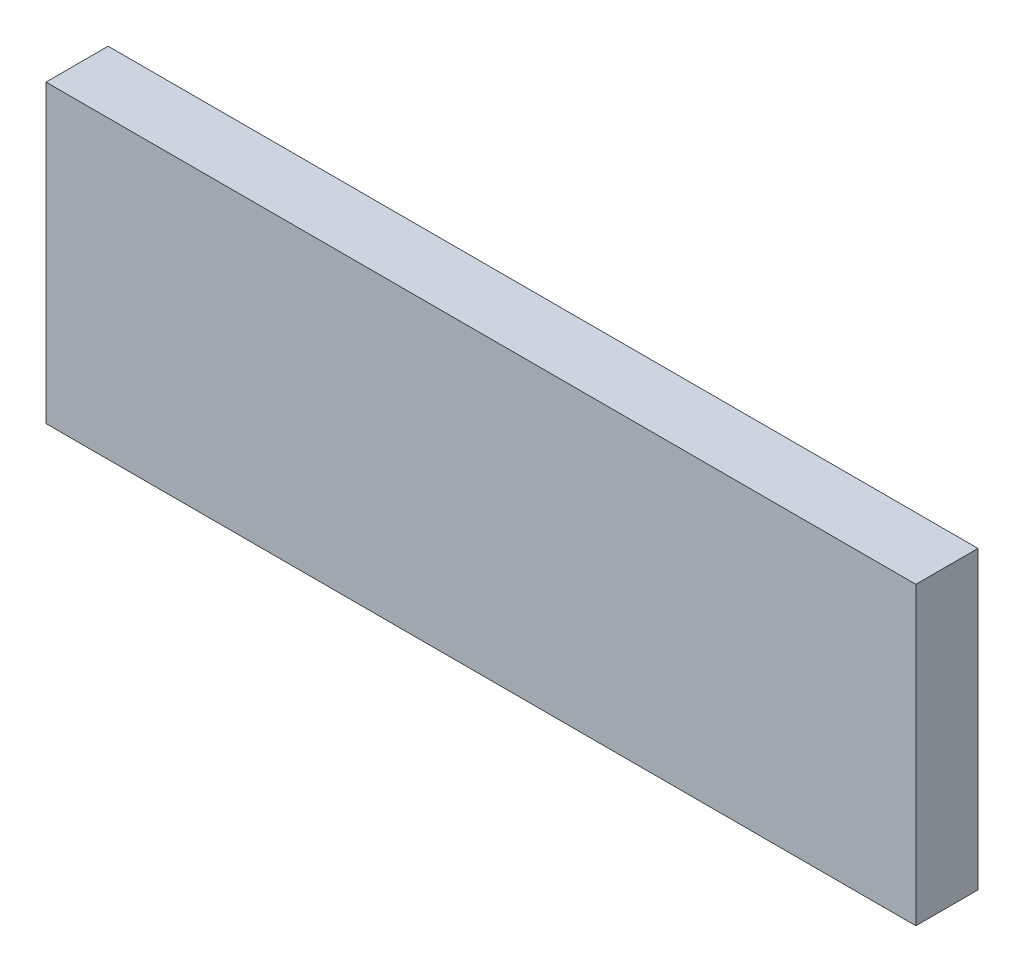
ISO-10303-21;
HEADER;
FILE_DESCRIPTION(('STEP AP214'),'2;1');
FILE_NAME('part.step','',(''),(''),'','','');
FILE_SCHEMA(('AUTOMOTIVE_DESIGN { 1 0 10303 214 1 1 1 1 }'));
ENDSEC;
DATA;
#1=APPLICATION_CONTEXT('core data for automotive mechanical design processes');
#2=APPLICATION_PROTOCOL_DEFINITION('international standard','automotive_design',2000,#1);
#3=PRODUCT_CONTEXT('',#1,'mechanical');
#4=PRODUCT('Part','Part','',(#3));
#5=PRODUCT_RELATED_PRODUCT_CATEGORY('part','',(#4));
#6=PRODUCT_DEFINITION_FORMATION('','',#4);
#7=PRODUCT_DEFINITION_CONTEXT('part definition',#1,'design');
#8=PRODUCT_DEFINITION('design','',#6,#7);
#9=PRODUCT_DEFINITION_SHAPE('','',#8);
#10=(LENGTH_UNIT() NAMED_UNIT(*) SI_UNIT(.MILLI.,.METRE.));
#11=(NAMED_UNIT(*) PLANE_ANGLE_UNIT() SI_UNIT($,.RADIAN.));
#12=(NAMED_UNIT(*) SI_UNIT($,.STERADIAN.) SOLID_ANGLE_UNIT());
#13=UNCERTAINTY_MEASURE_WITH_UNIT(LENGTH_MEASURE(1.E-05),#10,'distance_accuracy_value','');
#14=(GEOMETRIC_REPRESENTATION_CONTEXT(3) GLOBAL_UNCERTAINTY_ASSIGNED_CONTEXT((#13)) GLOBAL_UNIT_ASSIGNED_CONTEXT((#10,
#11,#12)) REPRESENTATION_CONTEXT('',''));
#15=CARTESIAN_POINT('',(0.,0.,0.));
#16=DIRECTION('',(0.,0.,1.));
#17=DIRECTION('',(1.,0.,0.));
#18=AXIS2_PLACEMENT_3D('',#15,#16,#17);
#19=CARTESIAN_POINT('',(88.9,30.226,12.7));
#20=DIRECTION('',(-1.,0.,0.));
#21=DIRECTION('',(0.,-1.,0.));
#22=AXIS2_PLACEMENT_3D('',#19,#20,#21);
#23=PLANE('',#22);
#24=DIRECTION('',(0.,1.,0.));
#25=VECTOR('',#24,1.);
#26=CARTESIAN_POINT('',(88.9,30.226,0.));
#27=LINE('',#26,#25);
#28=CARTESIAN_POINT('',(88.9,-30.226,0.));
#29=VERTEX_POINT('',#28);
#30=CARTESIAN_POINT('',(88.9,30.226,0.));
#31=VERTEX_POINT('',#30);
#32=EDGE_CURVE('E95',#29,#31,#27,.T.);
#33=ORIENTED_EDGE('',*,*,#32,.T.);
#34=DIRECTION('',(0.,0.,-1.));
#35=VECTOR('',#34,1.);
#36=CARTESIAN_POINT('',(88.9,30.226,12.7));
#37=LINE('',#36,#35);
#38=CARTESIAN_POINT('',(88.9,30.226,12.7));
#39=VERTEX_POINT('',#38);
#40=EDGE_CURVE('E11',#39,#31,#37,.T.);
#41=ORIENTED_EDGE('',*,*,#40,.F.);
#42=DIRECTION('',(0.,1.,0.));
#43=VECTOR('',#42,1.);
#44=CARTESIAN_POINT('',(88.9,30.226,12.7));
#45=LINE('',#44,#43);
#46=CARTESIAN_POINT('',(88.9,-30.226,12.7));
#47=VERTEX_POINT('',#46);
#48=EDGE_CURVE('E83',#47,#39,#45,.T.);
#49=ORIENTED_EDGE('',*,*,#48,.F.);
#50=DIRECTION('',(0.,0.,-1.));
#51=VECTOR('',#50,1.);
#52=CARTESIAN_POINT('',(88.9,-30.226,12.7));
#53=LINE('',#52,#51);
#54=EDGE_CURVE('E91',#47,#29,#53,.T.);
#55=ORIENTED_EDGE('',*,*,#54,.T.);
#56=EDGE_LOOP('',(#33,#41,#49,#55));
#57=FACE_BOUND('',#56,.T.);
#58=ADVANCED_FACE('F32',(#57),#23,.F.);
#59=CARTESIAN_POINT('',(-88.9,30.226,12.7));
#60=DIRECTION('',(0.,-1.,0.));
#61=DIRECTION('',(0.,0.,-1.));
#62=AXIS2_PLACEMENT_3D('',#59,#60,#61);
#63=PLANE('',#62);
#64=DIRECTION('',(-1.,0.,0.));
#65=VECTOR('',#64,1.);
#66=CARTESIAN_POINT('',(-88.9,30.226,0.));
#67=LINE('',#66,#65);
#68=CARTESIAN_POINT('',(-88.9,30.226,0.));
#69=VERTEX_POINT('',#68);
#70=EDGE_CURVE('E87',#31,#69,#67,.T.);
#71=ORIENTED_EDGE('',*,*,#70,.T.);
#72=DIRECTION('',(0.,0.,-1.));
#73=VECTOR('',#72,1.);
#74=CARTESIAN_POINT('',(-88.9,30.226,12.7));
#75=LINE('',#74,#73);
#76=CARTESIAN_POINT('',(-88.9,30.226,12.7));
#77=VERTEX_POINT('',#76);
#78=EDGE_CURVE('E40',#77,#69,#75,.T.);
#79=ORIENTED_EDGE('',*,*,#78,.F.);
#80=DIRECTION('',(-1.,0.,0.));
#81=VECTOR('',#80,1.);
#82=CARTESIAN_POINT('',(-88.9,30.226,12.7));
#83=LINE('',#82,#81);
#84=EDGE_CURVE('E78',#39,#77,#83,.T.);
#85=ORIENTED_EDGE('',*,*,#84,.F.);
#86=ORIENTED_EDGE('',*,*,#40,.T.);
#87=EDGE_LOOP('',(#71,#79,#85,#86));
#88=FACE_BOUND('',#87,.T.);
#89=ADVANCED_FACE('F86',(#88),#63,.F.);
#90=CARTESIAN_POINT('',(-88.9,30.226,12.7));
#91=DIRECTION('',(1.,0.,0.));
#92=DIRECTION('',(0.,0.,-1.));
#93=AXIS2_PLACEMENT_3D('',#90,#91,#92);
#94=PLANE('',#93);
#95=DIRECTION('',(0.,-1.,0.));
#96=VECTOR('',#95,1.);
#97=CARTESIAN_POINT('',(-88.9,30.226,0.));
#98=LINE('',#97,#96);
#99=CARTESIAN_POINT('',(-88.9,-30.226,0.));
#100=VERTEX_POINT('',#99);
#101=EDGE_CURVE('E65',#69,#100,#98,.T.);
#102=ORIENTED_EDGE('',*,*,#101,.T.);
#103=DIRECTION('',(0.,0.,-1.));
#104=VECTOR('',#103,1.);
#105=CARTESIAN_POINT('',(-88.9,-30.226,12.7));
#106=LINE('',#105,#104);
#107=CARTESIAN_POINT('',(-88.9,-30.226,12.7));
#108=VERTEX_POINT('',#107);
#109=EDGE_CURVE('E88',#108,#100,#106,.T.);
#110=ORIENTED_EDGE('',*,*,#109,.F.);
#111=DIRECTION('',(0.,-1.,0.));
#112=VECTOR('',#111,1.);
#113=CARTESIAN_POINT('',(-88.9,30.226,12.7));
#114=LINE('',#113,#112);
#115=EDGE_CURVE('E81',#77,#108,#114,.T.);
#116=ORIENTED_EDGE('',*,*,#115,.F.);
#117=ORIENTED_EDGE('',*,*,#78,.T.);
#118=EDGE_LOOP('',(#102,#110,#116,#117));
#119=FACE_BOUND('',#118,.T.);
#120=ADVANCED_FACE('F89',(#119),#94,.F.);
#121=CARTESIAN_POINT('',(-88.9,-30.226,12.7));
#122=DIRECTION('',(0.,1.,0.));
#123=DIRECTION('',(0.,0.,1.));
#124=AXIS2_PLACEMENT_3D('',#121,#122,#123);
#125=PLANE('',#124);
#126=DIRECTION('',(1.,0.,0.));
#127=VECTOR('',#126,1.);
#128=CARTESIAN_POINT('',(-88.9,-30.226,0.));
#129=LINE('',#128,#127);
#130=EDGE_CURVE('E71',#100,#29,#129,.T.);
#131=ORIENTED_EDGE('',*,*,#130,.T.);
#132=ORIENTED_EDGE('',*,*,#54,.F.);
#133=DIRECTION('',(1.,0.,0.));
#134=VECTOR('',#133,1.);
#135=CARTESIAN_POINT('',(-88.9,-30.226,12.7));
#136=LINE('',#135,#134);
#137=EDGE_CURVE('E48',#108,#47,#136,.T.);
#138=ORIENTED_EDGE('',*,*,#137,.F.);
#139=ORIENTED_EDGE('',*,*,#109,.T.);
#140=EDGE_LOOP('',(#131,#132,#138,#139));
#141=FACE_BOUND('',#140,.T.);
#142=ADVANCED_FACE('F102',(#141),#125,.F.);
#143=CARTESIAN_POINT('',(88.8999999999999,-30.226,12.7));
#144=DIRECTION('',(0.,0.,1.));
#145=DIRECTION('',(1.,0.,0.));
#146=AXIS2_PLACEMENT_3D('',#143,#144,#145);
#147=PLANE('',#146);
#148=ORIENTED_EDGE('',*,*,#48,.T.);
#149=ORIENTED_EDGE('',*,*,#84,.T.);
#150=ORIENTED_EDGE('',*,*,#115,.T.);
#151=ORIENTED_EDGE('',*,*,#137,.T.);
#152=EDGE_LOOP('',(#148,#149,#150,#151));
#153=FACE_BOUND('',#152,.T.);
#154=ADVANCED_FACE('F79',(#153),#147,.T.);
#155=CARTESIAN_POINT('',(88.8999999999999,-30.226,0.));
#156=DIRECTION('',(0.,0.,1.));
#157=DIRECTION('',(1.,0.,0.));
#158=AXIS2_PLACEMENT_3D('',#155,#156,#157);
#159=PLANE('',#158);
#160=ORIENTED_EDGE('',*,*,#32,.F.);
#161=ORIENTED_EDGE('',*,*,#130,.F.);
#162=ORIENTED_EDGE('',*,*,#101,.F.);
#163=ORIENTED_EDGE('',*,*,#70,.F.);
#164=EDGE_LOOP('',(#160,#161,#162,#163));
#165=FACE_BOUND('',#164,.T.);
#166=ADVANCED_FACE('F105',(#165),#159,.F.);
#167=CLOSED_SHELL('',(#58,#89,#120,#142,#154,#166));
#168=MANIFOLD_SOLID_BREP('B2',#167);
#169=ADVANCED_BREP_SHAPE_REPRESENTATION('',(#18,#168),#14);
#170=SHAPE_DEFINITION_REPRESENTATION(#9,#169);
ENDSEC;
END-ISO-10303-21;
